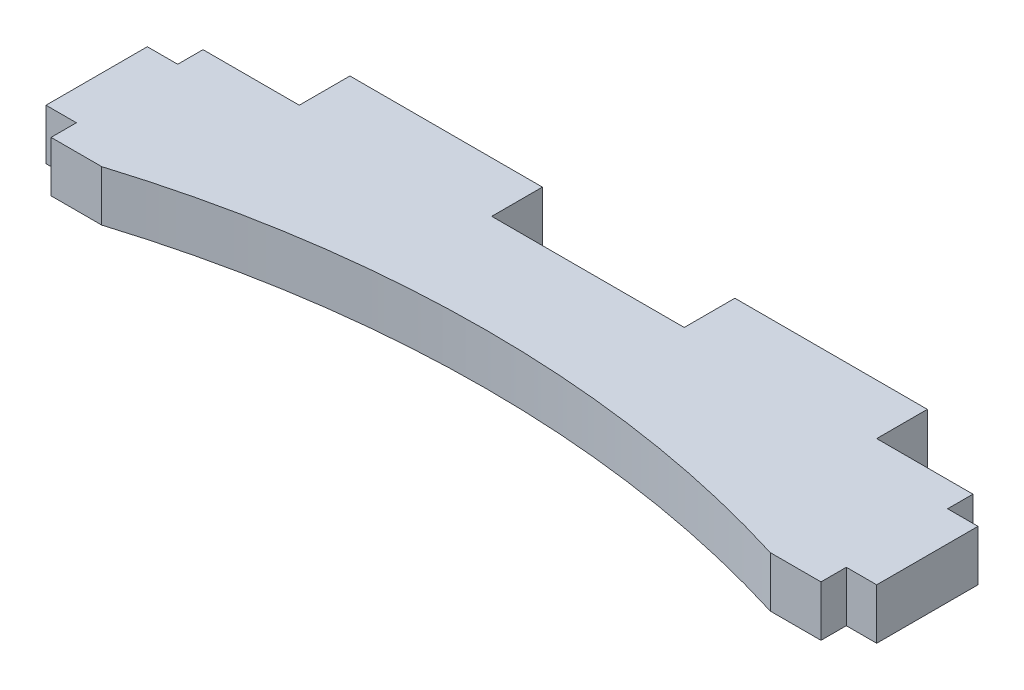
ISO-10303-21;
HEADER;
FILE_DESCRIPTION(('STEP AP214'),'2;1');
FILE_NAME('part.step','',(''),(''),'','','');
FILE_SCHEMA(('AUTOMOTIVE_DESIGN { 1 0 10303 214 1 1 1 1 }'));
ENDSEC;
DATA;
#1=APPLICATION_CONTEXT('core data for automotive mechanical design processes');
#2=APPLICATION_PROTOCOL_DEFINITION('international standard','automotive_design',2000,#1);
#3=PRODUCT_CONTEXT('',#1,'mechanical');
#4=PRODUCT('Part','Part','',(#3));
#5=PRODUCT_RELATED_PRODUCT_CATEGORY('part','',(#4));
#6=PRODUCT_DEFINITION_FORMATION('','',#4);
#7=PRODUCT_DEFINITION_CONTEXT('part definition',#1,'design');
#8=PRODUCT_DEFINITION('design','',#6,#7);
#9=PRODUCT_DEFINITION_SHAPE('','',#8);
#10=(LENGTH_UNIT() NAMED_UNIT(*) SI_UNIT(.MILLI.,.METRE.));
#11=(NAMED_UNIT(*) PLANE_ANGLE_UNIT() SI_UNIT($,.RADIAN.));
#12=(NAMED_UNIT(*) SI_UNIT($,.STERADIAN.) SOLID_ANGLE_UNIT());
#13=UNCERTAINTY_MEASURE_WITH_UNIT(LENGTH_MEASURE(1.E-05),#10,'distance_accuracy_value','');
#14=(GEOMETRIC_REPRESENTATION_CONTEXT(3) GLOBAL_UNCERTAINTY_ASSIGNED_CONTEXT((#13)) GLOBAL_UNIT_ASSIGNED_CONTEXT((#10,
#11,#12)) REPRESENTATION_CONTEXT('',''));
#15=CARTESIAN_POINT('',(0.,0.,0.));
#16=DIRECTION('',(0.,0.,1.));
#17=DIRECTION('',(1.,0.,0.));
#18=AXIS2_PLACEMENT_3D('',#15,#16,#17);
#19=CARTESIAN_POINT('',(-38.,5.,7.50000000000001));
#20=DIRECTION('',(0.,0.,-1.));
#21=DIRECTION('',(-1.,0.,0.));
#22=AXIS2_PLACEMENT_3D('',#19,#20,#21);
#23=PLANE('',#22);
#24=DIRECTION('',(1.,0.,0.));
#25=VECTOR('',#24,1.);
#26=CARTESIAN_POINT('',(-38.,0.,7.50000000000001));
#27=LINE('',#26,#25);
#28=CARTESIAN_POINT('',(-38.,0.,7.50000000000001));
#29=VERTEX_POINT('',#28);
#30=CARTESIAN_POINT('',(-33.,0.,7.50000000000001));
#31=VERTEX_POINT('',#30);
#32=EDGE_CURVE('E176',#29,#31,#27,.T.);
#33=ORIENTED_EDGE('',*,*,#32,.T.);
#34=DIRECTION('',(0.,1.,0.));
#35=VECTOR('',#34,1.);
#36=CARTESIAN_POINT('',(-33.,0.,7.50000000000001));
#37=LINE('',#36,#35);
#38=CARTESIAN_POINT('',(-33.,5.,7.50000000000001));
#39=VERTEX_POINT('',#38);
#40=EDGE_CURVE('E53',#31,#39,#37,.T.);
#41=ORIENTED_EDGE('',*,*,#40,.T.);
#42=DIRECTION('',(1.,0.,0.));
#43=VECTOR('',#42,1.);
#44=CARTESIAN_POINT('',(-38.,5.,7.50000000000001));
#45=LINE('',#44,#43);
#46=CARTESIAN_POINT('',(-38.,5.,7.50000000000001));
#47=VERTEX_POINT('',#46);
#48=EDGE_CURVE('E232',#47,#39,#45,.T.);
#49=ORIENTED_EDGE('',*,*,#48,.F.);
#50=DIRECTION('',(0.,-1.,0.));
#51=VECTOR('',#50,1.);
#52=CARTESIAN_POINT('',(-38.,5.,7.50000000000001));
#53=LINE('',#52,#51);
#54=EDGE_CURVE('E189',#47,#29,#53,.T.);
#55=ORIENTED_EDGE('',*,*,#54,.T.);
#56=EDGE_LOOP('',(#33,#41,#49,#55));
#57=FACE_BOUND('',#56,.T.);
#58=ADVANCED_FACE('F38',(#57),#23,.F.);
#59=CARTESIAN_POINT('',(-38.,5.,-7.49999999999999));
#60=DIRECTION('',(0.,0.,1.));
#61=DIRECTION('',(1.,0.,0.));
#62=AXIS2_PLACEMENT_3D('',#59,#60,#61);
#63=PLANE('',#62);
#64=DIRECTION('',(-1.,0.,0.));
#65=VECTOR('',#64,1.);
#66=CARTESIAN_POINT('',(-38.,0.,-7.49999999999999));
#67=LINE('',#66,#65);
#68=CARTESIAN_POINT('',(-28.5,0.,-7.49999999999999));
#69=VERTEX_POINT('',#68);
#70=CARTESIAN_POINT('',(-38.,0.,-7.49999999999999));
#71=VERTEX_POINT('',#70);
#72=EDGE_CURVE('E161',#69,#71,#67,.T.);
#73=ORIENTED_EDGE('',*,*,#72,.T.);
#74=DIRECTION('',(0.,-1.,0.));
#75=VECTOR('',#74,1.);
#76=CARTESIAN_POINT('',(-38.,5.,-7.49999999999999));
#77=LINE('',#76,#75);
#78=CARTESIAN_POINT('',(-38.,5.,-7.49999999999999));
#79=VERTEX_POINT('',#78);
#80=EDGE_CURVE('E11',#79,#71,#77,.T.);
#81=ORIENTED_EDGE('',*,*,#80,.F.);
#82=DIRECTION('',(-1.,0.,0.));
#83=VECTOR('',#82,1.);
#84=CARTESIAN_POINT('',(-38.,5.,-7.49999999999999));
#85=LINE('',#84,#83);
#86=CARTESIAN_POINT('',(-28.5,5.,-7.49999999999999));
#87=VERTEX_POINT('',#86);
#88=EDGE_CURVE('E185',#87,#79,#85,.T.);
#89=ORIENTED_EDGE('',*,*,#88,.F.);
#90=DIRECTION('',(0.,-1.,0.));
#91=VECTOR('',#90,1.);
#92=CARTESIAN_POINT('',(-28.5,5.,-7.49999999999999));
#93=LINE('',#92,#91);
#94=EDGE_CURVE('E157',#87,#69,#93,.T.);
#95=ORIENTED_EDGE('',*,*,#94,.T.);
#96=EDGE_LOOP('',(#73,#81,#89,#95));
#97=FACE_BOUND('',#96,.T.);
#98=ADVANCED_FACE('F40',(#97),#63,.F.);
#99=CARTESIAN_POINT('',(-38.,5.,-5.));
#100=DIRECTION('',(1.,0.,0.));
#101=DIRECTION('',(0.,0.,-1.));
#102=AXIS2_PLACEMENT_3D('',#99,#100,#101);
#103=PLANE('',#102);
#104=DIRECTION('',(0.,0.,1.));
#105=VECTOR('',#104,1.);
#106=CARTESIAN_POINT('',(-38.,0.,-5.));
#107=LINE('',#106,#105);
#108=CARTESIAN_POINT('',(-38.,0.,-5.));
#109=VERTEX_POINT('',#108);
#110=EDGE_CURVE('E164',#71,#109,#107,.T.);
#111=ORIENTED_EDGE('',*,*,#110,.T.);
#112=DIRECTION('',(0.,-1.,0.));
#113=VECTOR('',#112,1.);
#114=CARTESIAN_POINT('',(-38.,5.,-5.));
#115=LINE('',#114,#113);
#116=CARTESIAN_POINT('',(-38.,5.,-5.));
#117=VERTEX_POINT('',#116);
#118=EDGE_CURVE('E46',#117,#109,#115,.T.);
#119=ORIENTED_EDGE('',*,*,#118,.F.);
#120=DIRECTION('',(0.,0.,1.));
#121=VECTOR('',#120,1.);
#122=CARTESIAN_POINT('',(-38.,5.,-5.));
#123=LINE('',#122,#121);
#124=EDGE_CURVE('E109',#79,#117,#123,.T.);
#125=ORIENTED_EDGE('',*,*,#124,.F.);
#126=ORIENTED_EDGE('',*,*,#80,.T.);
#127=EDGE_LOOP('',(#111,#119,#125,#126));
#128=FACE_BOUND('',#127,.T.);
#129=ADVANCED_FACE('F339',(#128),#103,.F.);
#130=CARTESIAN_POINT('',(-41.,5.,-4.99999999999999));
#131=DIRECTION('',(0.,0.,1.));
#132=DIRECTION('',(1.,0.,0.));
#133=AXIS2_PLACEMENT_3D('',#130,#131,#132);
#134=PLANE('',#133);
#135=DIRECTION('',(-1.,0.,0.));
#136=VECTOR('',#135,1.);
#137=CARTESIAN_POINT('',(-41.,0.,-4.99999999999999));
#138=LINE('',#137,#136);
#139=CARTESIAN_POINT('',(-41.,0.,-4.99999999999999));
#140=VERTEX_POINT('',#139);
#141=EDGE_CURVE('E167',#109,#140,#138,.T.);
#142=ORIENTED_EDGE('',*,*,#141,.T.);
#143=DIRECTION('',(0.,-1.,0.));
#144=VECTOR('',#143,1.);
#145=CARTESIAN_POINT('',(-41.,5.,-4.99999999999999));
#146=LINE('',#145,#144);
#147=CARTESIAN_POINT('',(-41.,5.,-4.99999999999999));
#148=VERTEX_POINT('',#147);
#149=EDGE_CURVE('E198',#148,#140,#146,.T.);
#150=ORIENTED_EDGE('',*,*,#149,.F.);
#151=DIRECTION('',(-1.,0.,0.));
#152=VECTOR('',#151,1.);
#153=CARTESIAN_POINT('',(-41.,5.,-4.99999999999999));
#154=LINE('',#153,#152);
#155=EDGE_CURVE('E206',#117,#148,#154,.T.);
#156=ORIENTED_EDGE('',*,*,#155,.F.);
#157=ORIENTED_EDGE('',*,*,#118,.T.);
#158=EDGE_LOOP('',(#142,#150,#156,#157));
#159=FACE_BOUND('',#158,.T.);
#160=ADVANCED_FACE('F204',(#159),#134,.F.);
#161=CARTESIAN_POINT('',(-41.,5.,5.00000000000001));
#162=DIRECTION('',(1.,0.,0.));
#163=DIRECTION('',(0.,0.,-1.));
#164=AXIS2_PLACEMENT_3D('',#161,#162,#163);
#165=PLANE('',#164);
#166=DIRECTION('',(0.,0.,1.));
#167=VECTOR('',#166,1.);
#168=CARTESIAN_POINT('',(-41.,0.,5.00000000000001));
#169=LINE('',#168,#167);
#170=CARTESIAN_POINT('',(-41.,0.,5.00000000000001));
#171=VERTEX_POINT('',#170);
#172=EDGE_CURVE('E169',#140,#171,#169,.T.);
#173=ORIENTED_EDGE('',*,*,#172,.T.);
#174=DIRECTION('',(0.,-1.,0.));
#175=VECTOR('',#174,1.);
#176=CARTESIAN_POINT('',(-41.,5.,5.00000000000001));
#177=LINE('',#176,#175);
#178=CARTESIAN_POINT('',(-41.,5.,5.00000000000001));
#179=VERTEX_POINT('',#178);
#180=EDGE_CURVE('E195',#179,#171,#177,.T.);
#181=ORIENTED_EDGE('',*,*,#180,.F.);
#182=DIRECTION('',(0.,0.,1.));
#183=VECTOR('',#182,1.);
#184=CARTESIAN_POINT('',(-41.,5.,5.00000000000001));
#185=LINE('',#184,#183);
#186=EDGE_CURVE('E225',#148,#179,#185,.T.);
#187=ORIENTED_EDGE('',*,*,#186,.F.);
#188=ORIENTED_EDGE('',*,*,#149,.T.);
#189=EDGE_LOOP('',(#173,#181,#187,#188));
#190=FACE_BOUND('',#189,.T.);
#191=ADVANCED_FACE('F216',(#190),#165,.F.);
#192=CARTESIAN_POINT('',(-41.,5.,5.00000000000001));
#193=DIRECTION('',(0.,0.,-1.));
#194=DIRECTION('',(-1.,0.,0.));
#195=AXIS2_PLACEMENT_3D('',#192,#193,#194);
#196=PLANE('',#195);
#197=DIRECTION('',(1.,0.,0.));
#198=VECTOR('',#197,1.);
#199=CARTESIAN_POINT('',(-41.,0.,5.00000000000001));
#200=LINE('',#199,#198);
#201=CARTESIAN_POINT('',(-38.,0.,5.00000000000002));
#202=VERTEX_POINT('',#201);
#203=EDGE_CURVE('E171',#171,#202,#200,.T.);
#204=ORIENTED_EDGE('',*,*,#203,.T.);
#205=DIRECTION('',(0.,-1.,0.));
#206=VECTOR('',#205,1.);
#207=CARTESIAN_POINT('',(-38.,5.,5.00000000000002));
#208=LINE('',#207,#206);
#209=CARTESIAN_POINT('',(-38.,5.,5.00000000000002));
#210=VERTEX_POINT('',#209);
#211=EDGE_CURVE('E192',#210,#202,#208,.T.);
#212=ORIENTED_EDGE('',*,*,#211,.F.);
#213=DIRECTION('',(1.,0.,0.));
#214=VECTOR('',#213,1.);
#215=CARTESIAN_POINT('',(-41.,5.,5.00000000000001));
#216=LINE('',#215,#214);
#217=EDGE_CURVE('E222',#179,#210,#216,.T.);
#218=ORIENTED_EDGE('',*,*,#217,.F.);
#219=ORIENTED_EDGE('',*,*,#180,.T.);
#220=EDGE_LOOP('',(#204,#212,#218,#219));
#221=FACE_BOUND('',#220,.T.);
#222=ADVANCED_FACE('F220',(#221),#196,.F.);
#223=CARTESIAN_POINT('',(-38.,5.,5.00000000000002));
#224=DIRECTION('',(1.,0.,0.));
#225=DIRECTION('',(0.,0.,-1.));
#226=AXIS2_PLACEMENT_3D('',#223,#224,#225);
#227=PLANE('',#226);
#228=DIRECTION('',(0.,0.,1.));
#229=VECTOR('',#228,1.);
#230=CARTESIAN_POINT('',(-38.,0.,5.00000000000002));
#231=LINE('',#230,#229);
#232=EDGE_CURVE('E173',#202,#29,#231,.T.);
#233=ORIENTED_EDGE('',*,*,#232,.T.);
#234=ORIENTED_EDGE('',*,*,#54,.F.);
#235=DIRECTION('',(0.,0.,1.));
#236=VECTOR('',#235,1.);
#237=CARTESIAN_POINT('',(-38.,5.,5.00000000000002));
#238=LINE('',#237,#236);
#239=EDGE_CURVE('E224',#210,#47,#238,.T.);
#240=ORIENTED_EDGE('',*,*,#239,.F.);
#241=ORIENTED_EDGE('',*,*,#211,.T.);
#242=EDGE_LOOP('',(#233,#234,#240,#241));
#243=FACE_BOUND('',#242,.T.);
#244=ADVANCED_FACE('F355',(#243),#227,.F.);
#245=CARTESIAN_POINT('',(33.,5.,7.50000000000001));
#246=VERTEX_POINT('',#245);
#247=CARTESIAN_POINT('',(38.,5.,7.5));
#248=VERTEX_POINT('',#247);
#249=EDGE_CURVE('E227',#246,#248,#45,.T.);
#250=ORIENTED_EDGE('',*,*,#249,.F.);
#251=DIRECTION('',(0.,1.,0.));
#252=VECTOR('',#251,1.);
#253=CARTESIAN_POINT('',(33.,0.,7.50000000000001));
#254=LINE('',#253,#252);
#255=CARTESIAN_POINT('',(33.,0.,7.50000000000001));
#256=VERTEX_POINT('',#255);
#257=EDGE_CURVE('E289',#256,#246,#254,.T.);
#258=ORIENTED_EDGE('',*,*,#257,.F.);
#259=CARTESIAN_POINT('',(38.,0.,7.5));
#260=VERTEX_POINT('',#259);
#261=EDGE_CURVE('E175',#256,#260,#27,.T.);
#262=ORIENTED_EDGE('',*,*,#261,.T.);
#263=DIRECTION('',(0.,-1.,0.));
#264=VECTOR('',#263,1.);
#265=CARTESIAN_POINT('',(38.,5.,7.5));
#266=LINE('',#265,#264);
#267=EDGE_CURVE('E254',#248,#260,#266,.T.);
#268=ORIENTED_EDGE('',*,*,#267,.F.);
#269=EDGE_LOOP('',(#250,#258,#262,#268));
#270=FACE_BOUND('',#269,.T.);
#271=ADVANCED_FACE('F255',(#270),#23,.F.);
#272=CARTESIAN_POINT('',(-9.49999999999999,5.,-7.49999999999999));
#273=DIRECTION('',(0.,0.,1.));
#274=DIRECTION('',(1.,0.,0.));
#275=AXIS2_PLACEMENT_3D('',#272,#273,#274);
#276=PLANE('',#275);
#277=DIRECTION('',(-1.,0.,0.));
#278=VECTOR('',#277,1.);
#279=CARTESIAN_POINT('',(-9.49999999999999,0.,-7.49999999999999));
#280=LINE('',#279,#278);
#281=CARTESIAN_POINT('',(9.49999999999999,0.,-7.5));
#282=VERTEX_POINT('',#281);
#283=CARTESIAN_POINT('',(-9.49999999999999,0.,-7.49999999999999));
#284=VERTEX_POINT('',#283);
#285=EDGE_CURVE('E179',#282,#284,#280,.T.);
#286=ORIENTED_EDGE('',*,*,#285,.T.);
#287=DIRECTION('',(0.,-1.,0.));
#288=VECTOR('',#287,1.);
#289=CARTESIAN_POINT('',(-9.49999999999999,5.,-7.49999999999999));
#290=LINE('',#289,#288);
#291=CARTESIAN_POINT('',(-9.49999999999999,5.,-7.49999999999999));
#292=VERTEX_POINT('',#291);
#293=EDGE_CURVE('E152',#292,#284,#290,.T.);
#294=ORIENTED_EDGE('',*,*,#293,.F.);
#295=DIRECTION('',(-1.,0.,0.));
#296=VECTOR('',#295,1.);
#297=CARTESIAN_POINT('',(-9.49999999999999,5.,-7.49999999999999));
#298=LINE('',#297,#296);
#299=CARTESIAN_POINT('',(9.49999999999999,5.,-7.5));
#300=VERTEX_POINT('',#299);
#301=EDGE_CURVE('E140',#300,#292,#298,.T.);
#302=ORIENTED_EDGE('',*,*,#301,.F.);
#303=DIRECTION('',(0.,-1.,0.));
#304=VECTOR('',#303,1.);
#305=CARTESIAN_POINT('',(9.49999999999999,5.,-7.5));
#306=LINE('',#305,#304);
#307=EDGE_CURVE('E260',#300,#282,#306,.T.);
#308=ORIENTED_EDGE('',*,*,#307,.T.);
#309=EDGE_LOOP('',(#286,#294,#302,#308));
#310=FACE_BOUND('',#309,.T.);
#311=ADVANCED_FACE('F354',(#310),#276,.F.);
#312=CARTESIAN_POINT('',(-9.5,5.,-12.5));
#313=DIRECTION('',(-1.,0.,0.));
#314=DIRECTION('',(0.,0.,1.));
#315=AXIS2_PLACEMENT_3D('',#312,#313,#314);
#316=PLANE('',#315);
#317=DIRECTION('',(0.,0.,-1.));
#318=VECTOR('',#317,1.);
#319=CARTESIAN_POINT('',(-9.5,0.,-12.5));
#320=LINE('',#319,#318);
#321=CARTESIAN_POINT('',(-9.5,0.,-12.5));
#322=VERTEX_POINT('',#321);
#323=EDGE_CURVE('E149',#284,#322,#320,.T.);
#324=ORIENTED_EDGE('',*,*,#323,.T.);
#325=DIRECTION('',(0.,-1.,0.));
#326=VECTOR('',#325,1.);
#327=CARTESIAN_POINT('',(-9.5,5.,-12.5));
#328=LINE('',#327,#326);
#329=CARTESIAN_POINT('',(-9.5,5.,-12.5));
#330=VERTEX_POINT('',#329);
#331=EDGE_CURVE('E146',#330,#322,#328,.T.);
#332=ORIENTED_EDGE('',*,*,#331,.F.);
#333=DIRECTION('',(0.,0.,-1.));
#334=VECTOR('',#333,1.);
#335=CARTESIAN_POINT('',(-9.5,5.,-12.5));
#336=LINE('',#335,#334);
#337=EDGE_CURVE('E131',#292,#330,#336,.T.);
#338=ORIENTED_EDGE('',*,*,#337,.F.);
#339=ORIENTED_EDGE('',*,*,#293,.T.);
#340=EDGE_LOOP('',(#324,#332,#338,#339));
#341=FACE_BOUND('',#340,.T.);
#342=ADVANCED_FACE('F147',(#341),#316,.F.);
#343=CARTESIAN_POINT('',(-28.5,5.,-12.5));
#344=DIRECTION('',(0.,0.,1.));
#345=DIRECTION('',(1.,0.,0.));
#346=AXIS2_PLACEMENT_3D('',#343,#344,#345);
#347=PLANE('',#346);
#348=DIRECTION('',(-1.,0.,0.));
#349=VECTOR('',#348,1.);
#350=CARTESIAN_POINT('',(-28.5,0.,-12.5));
#351=LINE('',#350,#349);
#352=CARTESIAN_POINT('',(-28.5,0.,-12.5));
#353=VERTEX_POINT('',#352);
#354=EDGE_CURVE('E182',#322,#353,#351,.T.);
#355=ORIENTED_EDGE('',*,*,#354,.T.);
#356=DIRECTION('',(0.,-1.,0.));
#357=VECTOR('',#356,1.);
#358=CARTESIAN_POINT('',(-28.5,5.,-12.5));
#359=LINE('',#358,#357);
#360=CARTESIAN_POINT('',(-28.5,5.,-12.5));
#361=VERTEX_POINT('',#360);
#362=EDGE_CURVE('E153',#361,#353,#359,.T.);
#363=ORIENTED_EDGE('',*,*,#362,.F.);
#364=DIRECTION('',(-1.,0.,0.));
#365=VECTOR('',#364,1.);
#366=CARTESIAN_POINT('',(-28.5,5.,-12.5));
#367=LINE('',#366,#365);
#368=EDGE_CURVE('E136',#330,#361,#367,.T.);
#369=ORIENTED_EDGE('',*,*,#368,.F.);
#370=ORIENTED_EDGE('',*,*,#331,.T.);
#371=EDGE_LOOP('',(#355,#363,#369,#370));
#372=FACE_BOUND('',#371,.T.);
#373=ADVANCED_FACE('F155',(#372),#347,.F.);
#374=CARTESIAN_POINT('',(-28.5,5.,-7.49999999999999));
#375=DIRECTION('',(1.,0.,0.));
#376=DIRECTION('',(0.,0.,-1.));
#377=AXIS2_PLACEMENT_3D('',#374,#375,#376);
#378=PLANE('',#377);
#379=DIRECTION('',(0.,0.,1.));
#380=VECTOR('',#379,1.);
#381=CARTESIAN_POINT('',(-28.5,0.,-7.49999999999999));
#382=LINE('',#381,#380);
#383=EDGE_CURVE('E101',#353,#69,#382,.T.);
#384=ORIENTED_EDGE('',*,*,#383,.T.);
#385=ORIENTED_EDGE('',*,*,#94,.F.);
#386=DIRECTION('',(0.,0.,1.));
#387=VECTOR('',#386,1.);
#388=CARTESIAN_POINT('',(-28.5,5.,-7.49999999999999));
#389=LINE('',#388,#387);
#390=EDGE_CURVE('E62',#361,#87,#389,.T.);
#391=ORIENTED_EDGE('',*,*,#390,.F.);
#392=ORIENTED_EDGE('',*,*,#362,.T.);
#393=EDGE_LOOP('',(#384,#385,#391,#392));
#394=FACE_BOUND('',#393,.T.);
#395=ADVANCED_FACE('F402',(#394),#378,.F.);
#396=CARTESIAN_POINT('',(0.,5.,0.));
#397=DIRECTION('',(0.,1.,0.));
#398=DIRECTION('',(0.,0.,1.));
#399=AXIS2_PLACEMENT_3D('',#396,#397,#398);
#400=PLANE('',#399);
#401=CARTESIAN_POINT('',(0.,5.,113.9));
#402=DIRECTION('',(0.,1.,0.));
#403=DIRECTION('',(0.,0.,-1.));
#404=AXIS2_PLACEMENT_3D('',#401,#402,#403);
#405=CIRCLE('',#404,111.4);
#406=EDGE_CURVE('E247',#246,#39,#405,.T.);
#407=ORIENTED_EDGE('',*,*,#406,.F.);
#408=ORIENTED_EDGE('',*,*,#249,.T.);
#409=DIRECTION('',(0.,0.,1.));
#410=VECTOR('',#409,1.);
#411=CARTESIAN_POINT('',(38.,5.,5.00000000000001));
#412=LINE('',#411,#410);
#413=CARTESIAN_POINT('',(38.,5.,5.00000000000001));
#414=VERTEX_POINT('',#413);
#415=EDGE_CURVE('E244',#414,#248,#412,.T.);
#416=ORIENTED_EDGE('',*,*,#415,.F.);
#417=DIRECTION('',(-1.,0.,0.));
#418=VECTOR('',#417,1.);
#419=CARTESIAN_POINT('',(41.,5.,4.99999999999999));
#420=LINE('',#419,#418);
#421=CARTESIAN_POINT('',(41.,5.,4.99999999999999));
#422=VERTEX_POINT('',#421);
#423=EDGE_CURVE('E266',#422,#414,#420,.T.);
#424=ORIENTED_EDGE('',*,*,#423,.F.);
#425=DIRECTION('',(0.,0.,1.));
#426=VECTOR('',#425,1.);
#427=CARTESIAN_POINT('',(41.,5.,4.99999999999999));
#428=LINE('',#427,#426);
#429=CARTESIAN_POINT('',(41.,5.,-5.00000000000001));
#430=VERTEX_POINT('',#429);
#431=EDGE_CURVE('E269',#430,#422,#428,.T.);
#432=ORIENTED_EDGE('',*,*,#431,.F.);
#433=DIRECTION('',(1.,0.,0.));
#434=VECTOR('',#433,1.);
#435=CARTESIAN_POINT('',(41.,5.,-5.00000000000001));
#436=LINE('',#435,#434);
#437=CARTESIAN_POINT('',(38.,5.,-5.00000000000001));
#438=VERTEX_POINT('',#437);
#439=EDGE_CURVE('E278',#438,#430,#436,.T.);
#440=ORIENTED_EDGE('',*,*,#439,.F.);
#441=DIRECTION('',(0.,0.,1.));
#442=VECTOR('',#441,1.);
#443=CARTESIAN_POINT('',(38.,5.,-5.00000000000001));
#444=LINE('',#443,#442);
#445=CARTESIAN_POINT('',(38.,5.,-7.5));
#446=VERTEX_POINT('',#445);
#447=EDGE_CURVE('E281',#446,#438,#444,.T.);
#448=ORIENTED_EDGE('',*,*,#447,.F.);
#449=DIRECTION('',(1.,0.,0.));
#450=VECTOR('',#449,1.);
#451=CARTESIAN_POINT('',(38.,5.,-7.5));
#452=LINE('',#451,#450);
#453=CARTESIAN_POINT('',(28.5,5.,-7.5));
#454=VERTEX_POINT('',#453);
#455=EDGE_CURVE('E312',#454,#446,#452,.T.);
#456=ORIENTED_EDGE('',*,*,#455,.F.);
#457=DIRECTION('',(0.,0.,1.));
#458=VECTOR('',#457,1.);
#459=CARTESIAN_POINT('',(28.5,5.,-7.5));
#460=LINE('',#459,#458);
#461=CARTESIAN_POINT('',(28.5,5.,-12.5));
#462=VERTEX_POINT('',#461);
#463=EDGE_CURVE('E572',#462,#454,#460,.T.);
#464=ORIENTED_EDGE('',*,*,#463,.F.);
#465=DIRECTION('',(1.,0.,0.));
#466=VECTOR('',#465,1.);
#467=CARTESIAN_POINT('',(28.5,5.,-12.5));
#468=LINE('',#467,#466);
#469=CARTESIAN_POINT('',(9.49999999999999,5.,-12.5));
#470=VERTEX_POINT('',#469);
#471=EDGE_CURVE('E272',#470,#462,#468,.T.);
#472=ORIENTED_EDGE('',*,*,#471,.F.);
#473=DIRECTION('',(0.,0.,-1.));
#474=VECTOR('',#473,1.);
#475=CARTESIAN_POINT('',(9.49999999999999,5.,-12.5));
#476=LINE('',#475,#474);
#477=EDGE_CURVE('E267',#300,#470,#476,.T.);
#478=ORIENTED_EDGE('',*,*,#477,.F.);
#479=ORIENTED_EDGE('',*,*,#301,.T.);
#480=ORIENTED_EDGE('',*,*,#337,.T.);
#481=ORIENTED_EDGE('',*,*,#368,.T.);
#482=ORIENTED_EDGE('',*,*,#390,.T.);
#483=ORIENTED_EDGE('',*,*,#88,.T.);
#484=ORIENTED_EDGE('',*,*,#124,.T.);
#485=ORIENTED_EDGE('',*,*,#155,.T.);
#486=ORIENTED_EDGE('',*,*,#186,.T.);
#487=ORIENTED_EDGE('',*,*,#217,.T.);
#488=ORIENTED_EDGE('',*,*,#239,.T.);
#489=ORIENTED_EDGE('',*,*,#48,.T.);
#490=EDGE_LOOP('',(#407,#408,#416,#424,#432,#440,#448,#456,#464,#472,#478,#479,#480,#481,#482,
#483,#484,#485,#486,#487,#488,#489));
#491=FACE_BOUND('',#490,.T.);
#492=ADVANCED_FACE('F134',(#491),#400,.T.);
#493=CARTESIAN_POINT('',(0.,0.,0.));
#494=DIRECTION('',(0.,1.,0.));
#495=DIRECTION('',(0.,0.,1.));
#496=AXIS2_PLACEMENT_3D('',#493,#494,#495);
#497=PLANE('',#496);
#498=ORIENTED_EDGE('',*,*,#261,.F.);
#499=CARTESIAN_POINT('',(0.,0.,113.9));
#500=DIRECTION('',(0.,1.,0.));
#501=DIRECTION('',(0.,0.,-1.));
#502=AXIS2_PLACEMENT_3D('',#499,#500,#501);
#503=CIRCLE('',#502,111.4);
#504=EDGE_CURVE('E563',#256,#31,#503,.T.);
#505=ORIENTED_EDGE('',*,*,#504,.T.);
#506=ORIENTED_EDGE('',*,*,#32,.F.);
#507=ORIENTED_EDGE('',*,*,#232,.F.);
#508=ORIENTED_EDGE('',*,*,#203,.F.);
#509=ORIENTED_EDGE('',*,*,#172,.F.);
#510=ORIENTED_EDGE('',*,*,#141,.F.);
#511=ORIENTED_EDGE('',*,*,#110,.F.);
#512=ORIENTED_EDGE('',*,*,#72,.F.);
#513=ORIENTED_EDGE('',*,*,#383,.F.);
#514=ORIENTED_EDGE('',*,*,#354,.F.);
#515=ORIENTED_EDGE('',*,*,#323,.F.);
#516=ORIENTED_EDGE('',*,*,#285,.F.);
#517=DIRECTION('',(0.,0.,-1.));
#518=VECTOR('',#517,1.);
#519=CARTESIAN_POINT('',(9.49999999999999,0.,-12.5));
#520=LINE('',#519,#518);
#521=CARTESIAN_POINT('',(9.49999999999999,0.,-12.5));
#522=VERTEX_POINT('',#521);
#523=EDGE_CURVE('E295',#282,#522,#520,.T.);
#524=ORIENTED_EDGE('',*,*,#523,.T.);
#525=DIRECTION('',(1.,0.,0.));
#526=VECTOR('',#525,1.);
#527=CARTESIAN_POINT('',(28.5,0.,-12.5));
#528=LINE('',#527,#526);
#529=CARTESIAN_POINT('',(28.5,0.,-12.5));
#530=VERTEX_POINT('',#529);
#531=EDGE_CURVE('E292',#522,#530,#528,.T.);
#532=ORIENTED_EDGE('',*,*,#531,.T.);
#533=DIRECTION('',(0.,0.,1.));
#534=VECTOR('',#533,1.);
#535=CARTESIAN_POINT('',(28.5,0.,-7.5));
#536=LINE('',#535,#534);
#537=CARTESIAN_POINT('',(28.5,0.,-7.5));
#538=VERTEX_POINT('',#537);
#539=EDGE_CURVE('E288',#530,#538,#536,.T.);
#540=ORIENTED_EDGE('',*,*,#539,.T.);
#541=DIRECTION('',(1.,0.,0.));
#542=VECTOR('',#541,1.);
#543=CARTESIAN_POINT('',(38.,0.,-7.5));
#544=LINE('',#543,#542);
#545=CARTESIAN_POINT('',(38.,0.,-7.5));
#546=VERTEX_POINT('',#545);
#547=EDGE_CURVE('E285',#538,#546,#544,.T.);
#548=ORIENTED_EDGE('',*,*,#547,.T.);
#549=DIRECTION('',(0.,0.,1.));
#550=VECTOR('',#549,1.);
#551=CARTESIAN_POINT('',(38.,0.,-5.00000000000001));
#552=LINE('',#551,#550);
#553=CARTESIAN_POINT('',(38.,0.,-5.00000000000001));
#554=VERTEX_POINT('',#553);
#555=EDGE_CURVE('E309',#546,#554,#552,.T.);
#556=ORIENTED_EDGE('',*,*,#555,.T.);
#557=DIRECTION('',(1.,0.,0.));
#558=VECTOR('',#557,1.);
#559=CARTESIAN_POINT('',(41.,0.,-5.00000000000001));
#560=LINE('',#559,#558);
#561=CARTESIAN_POINT('',(41.,0.,-5.00000000000001));
#562=VERTEX_POINT('',#561);
#563=EDGE_CURVE('E306',#554,#562,#560,.T.);
#564=ORIENTED_EDGE('',*,*,#563,.T.);
#565=DIRECTION('',(0.,0.,1.));
#566=VECTOR('',#565,1.);
#567=CARTESIAN_POINT('',(41.,0.,4.99999999999999));
#568=LINE('',#567,#566);
#569=CARTESIAN_POINT('',(41.,0.,4.99999999999999));
#570=VERTEX_POINT('',#569);
#571=EDGE_CURVE('E303',#562,#570,#568,.T.);
#572=ORIENTED_EDGE('',*,*,#571,.T.);
#573=DIRECTION('',(-1.,0.,0.));
#574=VECTOR('',#573,1.);
#575=CARTESIAN_POINT('',(41.,0.,4.99999999999999));
#576=LINE('',#575,#574);
#577=CARTESIAN_POINT('',(38.,0.,5.00000000000001));
#578=VERTEX_POINT('',#577);
#579=EDGE_CURVE('E300',#570,#578,#576,.T.);
#580=ORIENTED_EDGE('',*,*,#579,.T.);
#581=DIRECTION('',(0.,0.,1.));
#582=VECTOR('',#581,1.);
#583=CARTESIAN_POINT('',(38.,0.,5.00000000000001));
#584=LINE('',#583,#582);
#585=EDGE_CURVE('E298',#578,#260,#584,.T.);
#586=ORIENTED_EDGE('',*,*,#585,.T.);
#587=EDGE_LOOP('',(#498,#505,#506,#507,#508,#509,#510,#511,#512,#513,#514,#515,#516,#524,#532,
#540,#548,#556,#564,#572,#580,#586));
#588=FACE_BOUND('',#587,.T.);
#589=ADVANCED_FACE('F210',(#588),#497,.F.);
#590=CARTESIAN_POINT('',(38.,5.,-7.5));
#591=DIRECTION('',(0.,0.,-1.));
#592=DIRECTION('',(-1.,0.,0.));
#593=AXIS2_PLACEMENT_3D('',#590,#591,#592);
#594=PLANE('',#593);
#595=ORIENTED_EDGE('',*,*,#547,.F.);
#596=DIRECTION('',(0.,-1.,0.));
#597=VECTOR('',#596,1.);
#598=CARTESIAN_POINT('',(28.5,5.,-7.5));
#599=LINE('',#598,#597);
#600=EDGE_CURVE('E165',#454,#538,#599,.T.);
#601=ORIENTED_EDGE('',*,*,#600,.F.);
#602=ORIENTED_EDGE('',*,*,#455,.T.);
#603=DIRECTION('',(0.,-1.,0.));
#604=VECTOR('',#603,1.);
#605=CARTESIAN_POINT('',(38.,5.,-7.5));
#606=LINE('',#605,#604);
#607=EDGE_CURVE('E284',#446,#546,#606,.T.);
#608=ORIENTED_EDGE('',*,*,#607,.T.);
#609=EDGE_LOOP('',(#595,#601,#602,#608));
#610=FACE_BOUND('',#609,.T.);
#611=ADVANCED_FACE('F427',(#610),#594,.T.);
#612=CARTESIAN_POINT('',(28.5,5.,-7.5));
#613=DIRECTION('',(1.,0.,0.));
#614=DIRECTION('',(0.,0.,-1.));
#615=AXIS2_PLACEMENT_3D('',#612,#613,#614);
#616=PLANE('',#615);
#617=ORIENTED_EDGE('',*,*,#539,.F.);
#618=DIRECTION('',(0.,-1.,0.));
#619=VECTOR('',#618,1.);
#620=CARTESIAN_POINT('',(28.5,5.,-12.5));
#621=LINE('',#620,#619);
#622=EDGE_CURVE('E330',#462,#530,#621,.T.);
#623=ORIENTED_EDGE('',*,*,#622,.F.);
#624=ORIENTED_EDGE('',*,*,#463,.T.);
#625=ORIENTED_EDGE('',*,*,#600,.T.);
#626=EDGE_LOOP('',(#617,#623,#624,#625));
#627=FACE_BOUND('',#626,.T.);
#628=ADVANCED_FACE('F432',(#627),#616,.T.);
#629=CARTESIAN_POINT('',(28.5,5.,-12.5));
#630=DIRECTION('',(0.,0.,-1.));
#631=DIRECTION('',(-1.,0.,0.));
#632=AXIS2_PLACEMENT_3D('',#629,#630,#631);
#633=PLANE('',#632);
#634=ORIENTED_EDGE('',*,*,#531,.F.);
#635=DIRECTION('',(0.,-1.,0.));
#636=VECTOR('',#635,1.);
#637=CARTESIAN_POINT('',(9.49999999999999,5.,-12.5));
#638=LINE('',#637,#636);
#639=EDGE_CURVE('E327',#470,#522,#638,.T.);
#640=ORIENTED_EDGE('',*,*,#639,.F.);
#641=ORIENTED_EDGE('',*,*,#471,.T.);
#642=ORIENTED_EDGE('',*,*,#622,.T.);
#643=EDGE_LOOP('',(#634,#640,#641,#642));
#644=FACE_BOUND('',#643,.T.);
#645=ADVANCED_FACE('F445',(#644),#633,.T.);
#646=CARTESIAN_POINT('',(9.49999999999999,5.,-12.5));
#647=DIRECTION('',(-1.,0.,0.));
#648=DIRECTION('',(0.,0.,1.));
#649=AXIS2_PLACEMENT_3D('',#646,#647,#648);
#650=PLANE('',#649);
#651=ORIENTED_EDGE('',*,*,#523,.F.);
#652=ORIENTED_EDGE('',*,*,#307,.F.);
#653=ORIENTED_EDGE('',*,*,#477,.T.);
#654=ORIENTED_EDGE('',*,*,#639,.T.);
#655=EDGE_LOOP('',(#651,#652,#653,#654));
#656=FACE_BOUND('',#655,.T.);
#657=ADVANCED_FACE('F456',(#656),#650,.T.);
#658=CARTESIAN_POINT('',(38.,5.,5.00000000000001));
#659=DIRECTION('',(1.,0.,0.));
#660=DIRECTION('',(0.,0.,-1.));
#661=AXIS2_PLACEMENT_3D('',#658,#659,#660);
#662=PLANE('',#661);
#663=ORIENTED_EDGE('',*,*,#585,.F.);
#664=DIRECTION('',(0.,-1.,0.));
#665=VECTOR('',#664,1.);
#666=CARTESIAN_POINT('',(38.,5.,5.00000000000001));
#667=LINE('',#666,#665);
#668=EDGE_CURVE('E261',#414,#578,#667,.T.);
#669=ORIENTED_EDGE('',*,*,#668,.F.);
#670=ORIENTED_EDGE('',*,*,#415,.T.);
#671=ORIENTED_EDGE('',*,*,#267,.T.);
#672=EDGE_LOOP('',(#663,#669,#670,#671));
#673=FACE_BOUND('',#672,.T.);
#674=ADVANCED_FACE('F264',(#673),#662,.T.);
#675=CARTESIAN_POINT('',(41.,5.,4.99999999999999));
#676=DIRECTION('',(0.,0.,1.));
#677=DIRECTION('',(1.,0.,0.));
#678=AXIS2_PLACEMENT_3D('',#675,#676,#677);
#679=PLANE('',#678);
#680=ORIENTED_EDGE('',*,*,#579,.F.);
#681=DIRECTION('',(0.,-1.,0.));
#682=VECTOR('',#681,1.);
#683=CARTESIAN_POINT('',(41.,5.,4.99999999999999));
#684=LINE('',#683,#682);
#685=EDGE_CURVE('E321',#422,#570,#684,.T.);
#686=ORIENTED_EDGE('',*,*,#685,.F.);
#687=ORIENTED_EDGE('',*,*,#423,.T.);
#688=ORIENTED_EDGE('',*,*,#668,.T.);
#689=EDGE_LOOP('',(#680,#686,#687,#688));
#690=FACE_BOUND('',#689,.T.);
#691=ADVANCED_FACE('F477',(#690),#679,.T.);
#692=CARTESIAN_POINT('',(41.,5.,4.99999999999999));
#693=DIRECTION('',(1.,0.,0.));
#694=DIRECTION('',(0.,0.,-1.));
#695=AXIS2_PLACEMENT_3D('',#692,#693,#694);
#696=PLANE('',#695);
#697=ORIENTED_EDGE('',*,*,#571,.F.);
#698=DIRECTION('',(0.,-1.,0.));
#699=VECTOR('',#698,1.);
#700=CARTESIAN_POINT('',(41.,5.,-5.00000000000001));
#701=LINE('',#700,#699);
#702=EDGE_CURVE('E318',#430,#562,#701,.T.);
#703=ORIENTED_EDGE('',*,*,#702,.F.);
#704=ORIENTED_EDGE('',*,*,#431,.T.);
#705=ORIENTED_EDGE('',*,*,#685,.T.);
#706=EDGE_LOOP('',(#697,#703,#704,#705));
#707=FACE_BOUND('',#706,.T.);
#708=ADVANCED_FACE('F487',(#707),#696,.T.);
#709=CARTESIAN_POINT('',(41.,5.,-5.00000000000001));
#710=DIRECTION('',(0.,0.,-1.));
#711=DIRECTION('',(-1.,0.,0.));
#712=AXIS2_PLACEMENT_3D('',#709,#710,#711);
#713=PLANE('',#712);
#714=ORIENTED_EDGE('',*,*,#563,.F.);
#715=DIRECTION('',(0.,-1.,0.));
#716=VECTOR('',#715,1.);
#717=CARTESIAN_POINT('',(38.,5.,-5.00000000000001));
#718=LINE('',#717,#716);
#719=EDGE_CURVE('E315',#438,#554,#718,.T.);
#720=ORIENTED_EDGE('',*,*,#719,.F.);
#721=ORIENTED_EDGE('',*,*,#439,.T.);
#722=ORIENTED_EDGE('',*,*,#702,.T.);
#723=EDGE_LOOP('',(#714,#720,#721,#722));
#724=FACE_BOUND('',#723,.T.);
#725=ADVANCED_FACE('F498',(#724),#713,.T.);
#726=CARTESIAN_POINT('',(38.,5.,-5.00000000000001));
#727=DIRECTION('',(1.,0.,0.));
#728=DIRECTION('',(0.,0.,-1.));
#729=AXIS2_PLACEMENT_3D('',#726,#727,#728);
#730=PLANE('',#729);
#731=ORIENTED_EDGE('',*,*,#555,.F.);
#732=ORIENTED_EDGE('',*,*,#607,.F.);
#733=ORIENTED_EDGE('',*,*,#447,.T.);
#734=ORIENTED_EDGE('',*,*,#719,.T.);
#735=EDGE_LOOP('',(#731,#732,#733,#734));
#736=FACE_BOUND('',#735,.T.);
#737=ADVANCED_FACE('F509',(#736),#730,.T.);
#738=CARTESIAN_POINT('',(0.,0.,113.9));
#739=DIRECTION('',(0.,1.,0.));
#740=DIRECTION('',(0.,0.,1.));
#741=AXIS2_PLACEMENT_3D('',#738,#739,#740);
#742=CYLINDRICAL_SURFACE('',#741,111.4);
#743=ORIENTED_EDGE('',*,*,#406,.T.);
#744=ORIENTED_EDGE('',*,*,#40,.F.);
#745=ORIENTED_EDGE('',*,*,#504,.F.);
#746=ORIENTED_EDGE('',*,*,#257,.T.);
#747=EDGE_LOOP('',(#743,#744,#745,#746));
#748=FACE_BOUND('',#747,.T.);
#749=ADVANCED_FACE('F519',(#748),#742,.F.);
#750=CLOSED_SHELL('',(#58,#98,#129,#160,#191,#222,#244,#271,#311,#342,#373,#395,#492,#589,#611,
#628,#645,#657,#674,#691,#708,#725,#737,#749));
#751=MANIFOLD_SOLID_BREP('B2',#750);
#752=ADVANCED_BREP_SHAPE_REPRESENTATION('',(#18,#751),#14);
#753=SHAPE_DEFINITION_REPRESENTATION(#9,#752);
ENDSEC;
END-ISO-10303-21;
